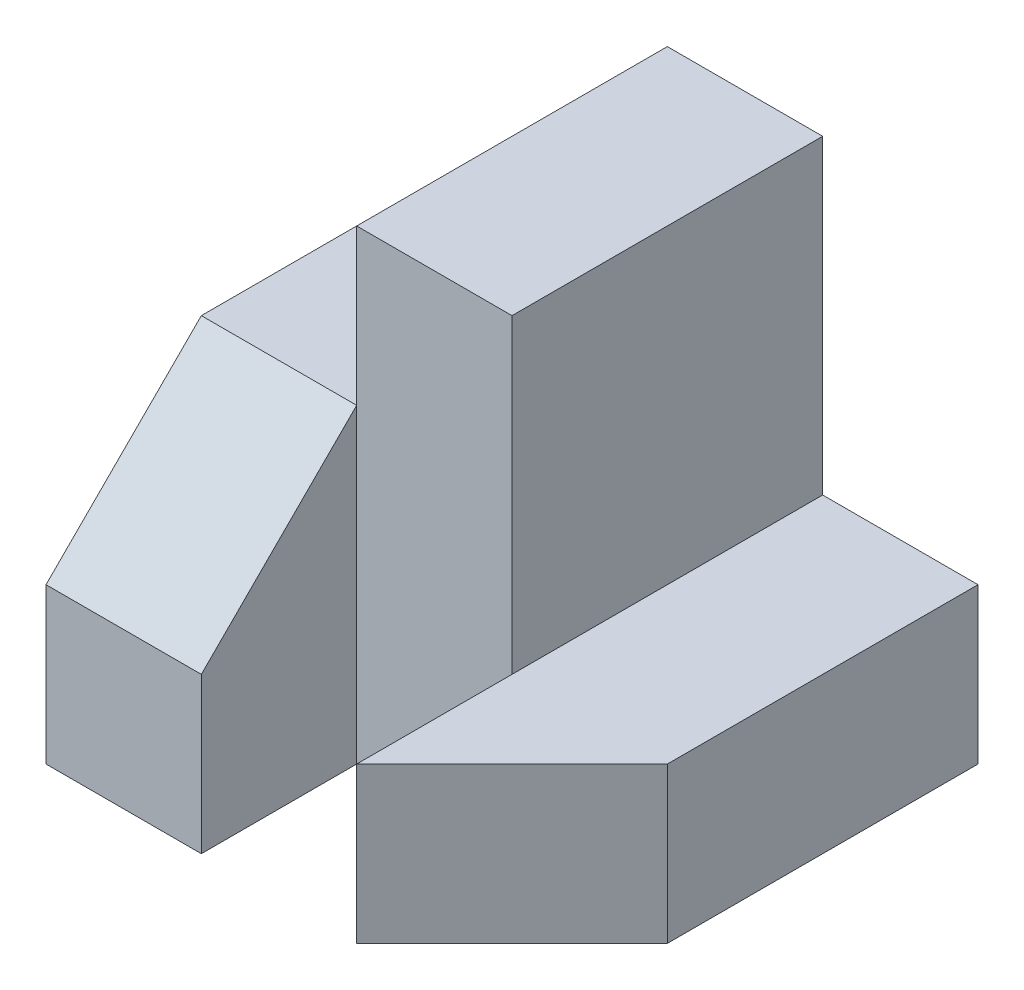
ISO-10303-21;
HEADER;
FILE_DESCRIPTION(('STEP AP214'),'2;1');
FILE_NAME('part.step','',(''),(''),'','','');
FILE_SCHEMA(('AUTOMOTIVE_DESIGN { 1 0 10303 214 1 1 1 1 }'));
ENDSEC;
DATA;
#1=APPLICATION_CONTEXT('core data for automotive mechanical design processes');
#2=APPLICATION_PROTOCOL_DEFINITION('international standard','automotive_design',2000,#1);
#3=PRODUCT_CONTEXT('',#1,'mechanical');
#4=PRODUCT('Part','Part','',(#3));
#5=PRODUCT_RELATED_PRODUCT_CATEGORY('part','',(#4));
#6=PRODUCT_DEFINITION_FORMATION('','',#4);
#7=PRODUCT_DEFINITION_CONTEXT('part definition',#1,'design');
#8=PRODUCT_DEFINITION('design','',#6,#7);
#9=PRODUCT_DEFINITION_SHAPE('','',#8);
#10=(LENGTH_UNIT() NAMED_UNIT(*) SI_UNIT(.MILLI.,.METRE.));
#11=(NAMED_UNIT(*) PLANE_ANGLE_UNIT() SI_UNIT($,.RADIAN.));
#12=(NAMED_UNIT(*) SI_UNIT($,.STERADIAN.) SOLID_ANGLE_UNIT());
#13=UNCERTAINTY_MEASURE_WITH_UNIT(LENGTH_MEASURE(1.E-05),#10,'distance_accuracy_value','');
#14=(GEOMETRIC_REPRESENTATION_CONTEXT(3) GLOBAL_UNCERTAINTY_ASSIGNED_CONTEXT((#13)) GLOBAL_UNIT_ASSIGNED_CONTEXT((#10,
#11,#12)) REPRESENTATION_CONTEXT('',''));
#15=CARTESIAN_POINT('',(0.,0.,0.));
#16=DIRECTION('',(0.,0.,1.));
#17=DIRECTION('',(1.,0.,0.));
#18=AXIS2_PLACEMENT_3D('',#15,#16,#17);
#19=CARTESIAN_POINT('',(20.,30.,-30.));
#20=DIRECTION('',(-1.,0.,0.));
#21=DIRECTION('',(0.,-1.,0.));
#22=AXIS2_PLACEMENT_3D('',#19,#20,#21);
#23=PLANE('',#22);
#24=DIRECTION('',(0.,-1.,0.));
#25=VECTOR('',#24,1.);
#26=CARTESIAN_POINT('',(20.,0.,-10.));
#27=LINE('',#26,#25);
#28=CARTESIAN_POINT('',(20.,30.,-10.));
#29=VERTEX_POINT('',#28);
#30=CARTESIAN_POINT('',(20.,10.,-10.));
#31=VERTEX_POINT('',#30);
#32=EDGE_CURVE('E191',#29,#31,#27,.T.);
#33=ORIENTED_EDGE('',*,*,#32,.T.);
#34=DIRECTION('',(0.,0.,1.));
#35=VECTOR('',#34,1.);
#36=CARTESIAN_POINT('',(20.,10.,-30.));
#37=LINE('',#36,#35);
#38=CARTESIAN_POINT('',(20.,10.,-30.));
#39=VERTEX_POINT('',#38);
#40=EDGE_CURVE('E168',#39,#31,#37,.T.);
#41=ORIENTED_EDGE('',*,*,#40,.F.);
#42=DIRECTION('',(0.,-1.,0.));
#43=VECTOR('',#42,1.);
#44=CARTESIAN_POINT('',(20.,30.,-30.));
#45=LINE('',#44,#43);
#46=CARTESIAN_POINT('',(20.,30.,-30.));
#47=VERTEX_POINT('',#46);
#48=EDGE_CURVE('E175',#47,#39,#45,.T.);
#49=ORIENTED_EDGE('',*,*,#48,.F.);
#50=DIRECTION('',(0.,0.,1.));
#51=VECTOR('',#50,1.);
#52=CARTESIAN_POINT('',(20.,30.,-30.));
#53=LINE('',#52,#51);
#54=EDGE_CURVE('E165',#47,#29,#53,.T.);
#55=ORIENTED_EDGE('',*,*,#54,.T.);
#56=EDGE_LOOP('',(#33,#41,#49,#55));
#57=FACE_BOUND('',#56,.T.);
#58=ADVANCED_FACE('F33',(#57),#23,.F.);
#59=CARTESIAN_POINT('',(0.,0.,-30.));
#60=DIRECTION('',(0.,-1.,0.));
#61=DIRECTION('',(0.,0.,-1.));
#62=AXIS2_PLACEMENT_3D('',#59,#60,#61);
#63=PLANE('',#62);
#64=DIRECTION('',(-0.707106781186551,0.,0.707106781186544));
#65=VECTOR('',#64,1.);
#66=CARTESIAN_POINT('',(9.9999999999999,0.,10.));
#67=LINE('',#66,#65);
#68=CARTESIAN_POINT('',(30.,0.,-9.9999999999999));
#69=VERTEX_POINT('',#68);
#70=CARTESIAN_POINT('',(20.,0.,0.));
#71=VERTEX_POINT('',#70);
#72=EDGE_CURVE('E113',#69,#71,#67,.T.);
#73=ORIENTED_EDGE('',*,*,#72,.T.);
#74=DIRECTION('',(0.,0.,1.));
#75=VECTOR('',#74,1.);
#76=CARTESIAN_POINT('',(20.,0.,0.));
#77=LINE('',#76,#75);
#78=CARTESIAN_POINT('',(20.,0.,-10.));
#79=VERTEX_POINT('',#78);
#80=EDGE_CURVE('E211',#79,#71,#77,.T.);
#81=ORIENTED_EDGE('',*,*,#80,.F.);
#82=DIRECTION('',(1.,0.,0.));
#83=VECTOR('',#82,1.);
#84=CARTESIAN_POINT('',(0.,0.,-10.));
#85=LINE('',#84,#83);
#86=CARTESIAN_POINT('',(10.,0.,-10.));
#87=VERTEX_POINT('',#86);
#88=EDGE_CURVE('E209',#87,#79,#85,.T.);
#89=ORIENTED_EDGE('',*,*,#88,.F.);
#90=DIRECTION('',(0.,0.,1.));
#91=VECTOR('',#90,1.);
#92=CARTESIAN_POINT('',(10.,0.,0.));
#93=LINE('',#92,#91);
#94=CARTESIAN_POINT('',(10.,0.,0.));
#95=VERTEX_POINT('',#94);
#96=EDGE_CURVE('E201',#87,#95,#93,.T.);
#97=ORIENTED_EDGE('',*,*,#96,.T.);
#98=DIRECTION('',(1.,0.,0.));
#99=VECTOR('',#98,1.);
#100=CARTESIAN_POINT('',(0.,0.,0.));
#101=LINE('',#100,#99);
#102=CARTESIAN_POINT('',(0.,0.,0.));
#103=VERTEX_POINT('',#102);
#104=EDGE_CURVE('E138',#103,#95,#101,.T.);
#105=ORIENTED_EDGE('',*,*,#104,.F.);
#106=DIRECTION('',(0.,0.,1.));
#107=VECTOR('',#106,1.);
#108=CARTESIAN_POINT('',(0.,0.,-30.));
#109=LINE('',#108,#107);
#110=CARTESIAN_POINT('',(0.,0.,-30.));
#111=VERTEX_POINT('',#110);
#112=EDGE_CURVE('E133',#111,#103,#109,.T.);
#113=ORIENTED_EDGE('',*,*,#112,.F.);
#114=DIRECTION('',(1.,0.,0.));
#115=VECTOR('',#114,1.);
#116=CARTESIAN_POINT('',(0.,0.,-30.));
#117=LINE('',#116,#115);
#118=CARTESIAN_POINT('',(30.,0.,-30.));
#119=VERTEX_POINT('',#118);
#120=EDGE_CURVE('E132',#111,#119,#117,.T.);
#121=ORIENTED_EDGE('',*,*,#120,.T.);
#122=DIRECTION('',(0.,0.,1.));
#123=VECTOR('',#122,1.);
#124=CARTESIAN_POINT('',(30.,0.,-30.));
#125=LINE('',#124,#123);
#126=EDGE_CURVE('E42',#119,#69,#125,.T.);
#127=ORIENTED_EDGE('',*,*,#126,.T.);
#128=EDGE_LOOP('',(#73,#81,#89,#97,#105,#113,#121,#127));
#129=FACE_BOUND('',#128,.T.);
#130=ADVANCED_FACE('F129',(#129),#63,.T.);
#131=CARTESIAN_POINT('',(0.,0.,-30.));
#132=DIRECTION('',(-1.,0.,0.));
#133=DIRECTION('',(0.,0.,1.));
#134=AXIS2_PLACEMENT_3D('',#131,#132,#133);
#135=PLANE('',#134);
#136=DIRECTION('',(0.,-1.,0.));
#137=VECTOR('',#136,1.);
#138=CARTESIAN_POINT('',(0.,0.,0.));
#139=LINE('',#138,#137);
#140=CARTESIAN_POINT('',(0.,10.,0.));
#141=VERTEX_POINT('',#140);
#142=EDGE_CURVE('E142',#141,#103,#139,.T.);
#143=ORIENTED_EDGE('',*,*,#142,.F.);
#144=DIRECTION('',(0.,-0.707106781186548,0.707106781186548));
#145=VECTOR('',#144,1.);
#146=CARTESIAN_POINT('',(0.,5.,5.));
#147=LINE('',#146,#145);
#148=CARTESIAN_POINT('',(0.,20.,-10.));
#149=VERTEX_POINT('',#148);
#150=EDGE_CURVE('E186',#149,#141,#147,.T.);
#151=ORIENTED_EDGE('',*,*,#150,.F.);
#152=DIRECTION('',(0.,0.,1.));
#153=VECTOR('',#152,1.);
#154=CARTESIAN_POINT('',(0.,20.,-30.));
#155=LINE('',#154,#153);
#156=CARTESIAN_POINT('',(0.,20.,-30.));
#157=VERTEX_POINT('',#156);
#158=EDGE_CURVE('E151',#157,#149,#155,.T.);
#159=ORIENTED_EDGE('',*,*,#158,.F.);
#160=DIRECTION('',(0.,-1.,0.));
#161=VECTOR('',#160,1.);
#162=CARTESIAN_POINT('',(0.,0.,-30.));
#163=LINE('',#162,#161);
#164=EDGE_CURVE('E141',#157,#111,#163,.T.);
#165=ORIENTED_EDGE('',*,*,#164,.T.);
#166=ORIENTED_EDGE('',*,*,#112,.T.);
#167=EDGE_LOOP('',(#143,#151,#159,#165,#166));
#168=FACE_BOUND('',#167,.T.);
#169=ADVANCED_FACE('F35',(#168),#135,.T.);
#170=CARTESIAN_POINT('',(0.,30.,-30.));
#171=DIRECTION('',(0.,1.,0.));
#172=DIRECTION('',(0.,0.,1.));
#173=AXIS2_PLACEMENT_3D('',#170,#171,#172);
#174=PLANE('',#173);
#175=DIRECTION('',(0.,0.,1.));
#176=VECTOR('',#175,1.);
#177=CARTESIAN_POINT('',(10.,30.,-30.));
#178=LINE('',#177,#176);
#179=CARTESIAN_POINT('',(10.,30.,-30.));
#180=VERTEX_POINT('',#179);
#181=CARTESIAN_POINT('',(10.,30.,-10.));
#182=VERTEX_POINT('',#181);
#183=EDGE_CURVE('E145',#180,#182,#178,.T.);
#184=ORIENTED_EDGE('',*,*,#183,.T.);
#185=DIRECTION('',(1.,0.,0.));
#186=VECTOR('',#185,1.);
#187=CARTESIAN_POINT('',(0.,30.,-10.));
#188=LINE('',#187,#186);
#189=EDGE_CURVE('E182',#182,#29,#188,.T.);
#190=ORIENTED_EDGE('',*,*,#189,.T.);
#191=ORIENTED_EDGE('',*,*,#54,.F.);
#192=DIRECTION('',(-1.,0.,0.));
#193=VECTOR('',#192,1.);
#194=CARTESIAN_POINT('',(0.,30.,-30.));
#195=LINE('',#194,#193);
#196=EDGE_CURVE('E136',#47,#180,#195,.T.);
#197=ORIENTED_EDGE('',*,*,#196,.T.);
#198=EDGE_LOOP('',(#184,#190,#191,#197));
#199=FACE_BOUND('',#198,.T.);
#200=ADVANCED_FACE('F248',(#199),#174,.T.);
#201=CARTESIAN_POINT('',(0.,0.,0.));
#202=DIRECTION('',(0.,0.,-1.));
#203=DIRECTION('',(-1.,0.,0.));
#204=AXIS2_PLACEMENT_3D('',#201,#202,#203);
#205=PLANE('',#204);
#206=ORIENTED_EDGE('',*,*,#104,.T.);
#207=DIRECTION('',(0.,1.,0.));
#208=VECTOR('',#207,1.);
#209=CARTESIAN_POINT('',(10.,0.,0.));
#210=LINE('',#209,#208);
#211=CARTESIAN_POINT('',(10.,10.,0.));
#212=VERTEX_POINT('',#211);
#213=EDGE_CURVE('E203',#95,#212,#210,.T.);
#214=ORIENTED_EDGE('',*,*,#213,.T.);
#215=DIRECTION('',(1.,0.,0.));
#216=VECTOR('',#215,1.);
#217=CARTESIAN_POINT('',(0.,10.,0.));
#218=LINE('',#217,#216);
#219=EDGE_CURVE('E185',#141,#212,#218,.T.);
#220=ORIENTED_EDGE('',*,*,#219,.F.);
#221=ORIENTED_EDGE('',*,*,#142,.T.);
#222=EDGE_LOOP('',(#206,#214,#220,#221));
#223=FACE_BOUND('',#222,.T.);
#224=ADVANCED_FACE('F231',(#223),#205,.F.);
#225=CARTESIAN_POINT('',(10.,30.,-30.));
#226=DIRECTION('',(1.,0.,0.));
#227=DIRECTION('',(0.,0.,-1.));
#228=AXIS2_PLACEMENT_3D('',#225,#226,#227);
#229=PLANE('',#228);
#230=DIRECTION('',(0.,-1.,0.));
#231=VECTOR('',#230,1.);
#232=CARTESIAN_POINT('',(10.,30.,-9.99999999999999));
#233=LINE('',#232,#231);
#234=CARTESIAN_POINT('',(10.,20.,-10.));
#235=VERTEX_POINT('',#234);
#236=EDGE_CURVE('E178',#182,#235,#233,.T.);
#237=ORIENTED_EDGE('',*,*,#236,.F.);
#238=ORIENTED_EDGE('',*,*,#183,.F.);
#239=DIRECTION('',(0.,1.,0.));
#240=VECTOR('',#239,1.);
#241=CARTESIAN_POINT('',(10.,30.,-30.));
#242=LINE('',#241,#240);
#243=CARTESIAN_POINT('',(10.,20.,-30.));
#244=VERTEX_POINT('',#243);
#245=EDGE_CURVE('E155',#244,#180,#242,.T.);
#246=ORIENTED_EDGE('',*,*,#245,.F.);
#247=DIRECTION('',(0.,0.,1.));
#248=VECTOR('',#247,1.);
#249=CARTESIAN_POINT('',(10.,20.,-30.));
#250=LINE('',#249,#248);
#251=EDGE_CURVE('E154',#244,#235,#250,.T.);
#252=ORIENTED_EDGE('',*,*,#251,.T.);
#253=EDGE_LOOP('',(#237,#238,#246,#252));
#254=FACE_BOUND('',#253,.T.);
#255=ADVANCED_FACE('F251',(#254),#229,.F.);
#256=CARTESIAN_POINT('',(0.,20.,-30.));
#257=DIRECTION('',(0.,-1.,0.));
#258=DIRECTION('',(0.,0.,-1.));
#259=AXIS2_PLACEMENT_3D('',#256,#257,#258);
#260=PLANE('',#259);
#261=DIRECTION('',(1.,0.,0.));
#262=VECTOR('',#261,1.);
#263=CARTESIAN_POINT('',(0.,20.,-10.));
#264=LINE('',#263,#262);
#265=EDGE_CURVE('E181',#149,#235,#264,.T.);
#266=ORIENTED_EDGE('',*,*,#265,.T.);
#267=ORIENTED_EDGE('',*,*,#251,.F.);
#268=DIRECTION('',(1.,0.,0.));
#269=VECTOR('',#268,1.);
#270=CARTESIAN_POINT('',(0.,20.,-30.));
#271=LINE('',#270,#269);
#272=EDGE_CURVE('E162',#157,#244,#271,.T.);
#273=ORIENTED_EDGE('',*,*,#272,.F.);
#274=ORIENTED_EDGE('',*,*,#158,.T.);
#275=EDGE_LOOP('',(#266,#267,#273,#274));
#276=FACE_BOUND('',#275,.T.);
#277=ADVANCED_FACE('F240',(#276),#260,.F.);
#278=CARTESIAN_POINT('',(30.,0.,-30.));
#279=DIRECTION('',(1.,0.,0.));
#280=DIRECTION('',(0.,0.,-1.));
#281=AXIS2_PLACEMENT_3D('',#278,#279,#280);
#282=PLANE('',#281);
#283=DIRECTION('',(0.,1.,0.));
#284=VECTOR('',#283,1.);
#285=CARTESIAN_POINT('',(30.,0.,-9.9999999999999));
#286=LINE('',#285,#284);
#287=CARTESIAN_POINT('',(30.,10.,-9.9999999999999));
#288=VERTEX_POINT('',#287);
#289=EDGE_CURVE('E115',#69,#288,#286,.T.);
#290=ORIENTED_EDGE('',*,*,#289,.F.);
#291=ORIENTED_EDGE('',*,*,#126,.F.);
#292=DIRECTION('',(0.,1.,0.));
#293=VECTOR('',#292,1.);
#294=CARTESIAN_POINT('',(30.,0.,-30.));
#295=LINE('',#294,#293);
#296=CARTESIAN_POINT('',(30.,10.,-30.));
#297=VERTEX_POINT('',#296);
#298=EDGE_CURVE('E147',#119,#297,#295,.T.);
#299=ORIENTED_EDGE('',*,*,#298,.T.);
#300=DIRECTION('',(0.,0.,1.));
#301=VECTOR('',#300,1.);
#302=CARTESIAN_POINT('',(30.,10.,-30.));
#303=LINE('',#302,#301);
#304=EDGE_CURVE('E125',#297,#288,#303,.T.);
#305=ORIENTED_EDGE('',*,*,#304,.T.);
#306=EDGE_LOOP('',(#290,#291,#299,#305));
#307=FACE_BOUND('',#306,.T.);
#308=ADVANCED_FACE('F124',(#307),#282,.T.);
#309=CARTESIAN_POINT('',(0.,0.,-30.));
#310=DIRECTION('',(0.,0.,-1.));
#311=DIRECTION('',(-1.,0.,0.));
#312=AXIS2_PLACEMENT_3D('',#309,#310,#311);
#313=PLANE('',#312);
#314=DIRECTION('',(1.,0.,0.));
#315=VECTOR('',#314,1.);
#316=CARTESIAN_POINT('',(30.,10.,-30.));
#317=LINE('',#316,#315);
#318=EDGE_CURVE('E169',#39,#297,#317,.T.);
#319=ORIENTED_EDGE('',*,*,#318,.T.);
#320=ORIENTED_EDGE('',*,*,#298,.F.);
#321=ORIENTED_EDGE('',*,*,#120,.F.);
#322=ORIENTED_EDGE('',*,*,#164,.F.);
#323=ORIENTED_EDGE('',*,*,#272,.T.);
#324=ORIENTED_EDGE('',*,*,#245,.T.);
#325=ORIENTED_EDGE('',*,*,#196,.F.);
#326=ORIENTED_EDGE('',*,*,#48,.T.);
#327=EDGE_LOOP('',(#319,#320,#321,#322,#323,#324,#325,#326));
#328=FACE_BOUND('',#327,.T.);
#329=ADVANCED_FACE('F243',(#328),#313,.T.);
#330=CARTESIAN_POINT('',(30.,10.,-30.));
#331=DIRECTION('',(0.,-1.,0.));
#332=DIRECTION('',(0.,0.,-1.));
#333=AXIS2_PLACEMENT_3D('',#330,#331,#332);
#334=PLANE('',#333);
#335=DIRECTION('',(0.,0.,-1.));
#336=VECTOR('',#335,1.);
#337=CARTESIAN_POINT('',(20.,10.,-30.));
#338=LINE('',#337,#336);
#339=CARTESIAN_POINT('',(20.,9.99999999999999,0.));
#340=VERTEX_POINT('',#339);
#341=EDGE_CURVE('E193',#340,#31,#338,.T.);
#342=ORIENTED_EDGE('',*,*,#341,.F.);
#343=DIRECTION('',(0.707106781186551,0.,-0.707106781186544));
#344=VECTOR('',#343,1.);
#345=CARTESIAN_POINT('',(40.0000000000001,10.,-19.9999999999998));
#346=LINE('',#345,#344);
#347=EDGE_CURVE('E126',#340,#288,#346,.T.);
#348=ORIENTED_EDGE('',*,*,#347,.T.);
#349=ORIENTED_EDGE('',*,*,#304,.F.);
#350=ORIENTED_EDGE('',*,*,#318,.F.);
#351=ORIENTED_EDGE('',*,*,#40,.T.);
#352=EDGE_LOOP('',(#342,#348,#349,#350,#351));
#353=FACE_BOUND('',#352,.T.);
#354=ADVANCED_FACE('F215',(#353),#334,.F.);
#355=CARTESIAN_POINT('',(0.,0.,-10.));
#356=DIRECTION('',(0.,0.,1.));
#357=DIRECTION('',(0.,-1.,0.));
#358=AXIS2_PLACEMENT_3D('',#355,#356,#357);
#359=PLANE('',#358);
#360=ORIENTED_EDGE('',*,*,#236,.T.);
#361=DIRECTION('',(0.,1.,0.));
#362=VECTOR('',#361,1.);
#363=CARTESIAN_POINT('',(10.,0.,-10.));
#364=LINE('',#363,#362);
#365=EDGE_CURVE('E200',#87,#235,#364,.T.);
#366=ORIENTED_EDGE('',*,*,#365,.F.);
#367=ORIENTED_EDGE('',*,*,#88,.T.);
#368=DIRECTION('',(0.,1.,0.));
#369=VECTOR('',#368,1.);
#370=CARTESIAN_POINT('',(20.,0.,-10.));
#371=LINE('',#370,#369);
#372=EDGE_CURVE('E197',#79,#31,#371,.T.);
#373=ORIENTED_EDGE('',*,*,#372,.T.);
#374=ORIENTED_EDGE('',*,*,#32,.F.);
#375=ORIENTED_EDGE('',*,*,#189,.F.);
#376=EDGE_LOOP('',(#360,#366,#367,#373,#374,#375));
#377=FACE_BOUND('',#376,.T.);
#378=ADVANCED_FACE('F224',(#377),#359,.T.);
#379=CARTESIAN_POINT('',(0.,5.,5.));
#380=DIRECTION('',(0.,0.707106781186547,0.707106781186547));
#381=DIRECTION('',(0.,-0.707106781186548,0.707106781186548));
#382=AXIS2_PLACEMENT_3D('',#379,#380,#381);
#383=PLANE('',#382);
#384=DIRECTION('',(0.,-0.707106781186547,0.707106781186547));
#385=VECTOR('',#384,1.);
#386=CARTESIAN_POINT('',(10.,5.,5.));
#387=LINE('',#386,#385);
#388=EDGE_CURVE('E11',#235,#212,#387,.T.);
#389=ORIENTED_EDGE('',*,*,#388,.F.);
#390=ORIENTED_EDGE('',*,*,#265,.F.);
#391=ORIENTED_EDGE('',*,*,#150,.T.);
#392=ORIENTED_EDGE('',*,*,#219,.T.);
#393=EDGE_LOOP('',(#389,#390,#391,#392));
#394=FACE_BOUND('',#393,.T.);
#395=ADVANCED_FACE('F234',(#394),#383,.T.);
#396=CARTESIAN_POINT('',(20.,0.,0.));
#397=DIRECTION('',(-1.,0.,0.));
#398=DIRECTION('',(0.,0.,1.));
#399=AXIS2_PLACEMENT_3D('',#396,#397,#398);
#400=PLANE('',#399);
#401=ORIENTED_EDGE('',*,*,#341,.T.);
#402=ORIENTED_EDGE('',*,*,#372,.F.);
#403=ORIENTED_EDGE('',*,*,#80,.T.);
#404=DIRECTION('',(0.,1.,0.));
#405=VECTOR('',#404,1.);
#406=CARTESIAN_POINT('',(20.,0.,0.));
#407=LINE('',#406,#405);
#408=EDGE_CURVE('E118',#71,#340,#407,.T.);
#409=ORIENTED_EDGE('',*,*,#408,.T.);
#410=EDGE_LOOP('',(#401,#402,#403,#409));
#411=FACE_BOUND('',#410,.T.);
#412=ADVANCED_FACE('F218',(#411),#400,.T.);
#413=CARTESIAN_POINT('',(10.,0.,0.));
#414=DIRECTION('',(-1.,0.,0.));
#415=DIRECTION('',(0.,0.,1.));
#416=AXIS2_PLACEMENT_3D('',#413,#414,#415);
#417=PLANE('',#416);
#418=ORIENTED_EDGE('',*,*,#388,.T.);
#419=ORIENTED_EDGE('',*,*,#213,.F.);
#420=ORIENTED_EDGE('',*,*,#96,.F.);
#421=ORIENTED_EDGE('',*,*,#365,.T.);
#422=EDGE_LOOP('',(#418,#419,#420,#421));
#423=FACE_BOUND('',#422,.T.);
#424=ADVANCED_FACE('F228',(#423),#417,.F.);
#425=CARTESIAN_POINT('',(9.9999999999999,0.,10.));
#426=DIRECTION('',(-0.707106781186544,0.,-0.707106781186551));
#427=DIRECTION('',(-0.707106781186551,0.,0.707106781186544));
#428=AXIS2_PLACEMENT_3D('',#425,#426,#427);
#429=PLANE('',#428);
#430=ORIENTED_EDGE('',*,*,#408,.F.);
#431=ORIENTED_EDGE('',*,*,#72,.F.);
#432=ORIENTED_EDGE('',*,*,#289,.T.);
#433=ORIENTED_EDGE('',*,*,#347,.F.);
#434=EDGE_LOOP('',(#430,#431,#432,#433));
#435=FACE_BOUND('',#434,.T.);
#436=ADVANCED_FACE('F114',(#435),#429,.F.);
#437=CLOSED_SHELL('',(#58,#130,#169,#200,#224,#255,#277,#308,#329,#354,#378,#395,#412,#424,#436));
#438=MANIFOLD_SOLID_BREP('B2',#437);
#439=ADVANCED_BREP_SHAPE_REPRESENTATION('',(#18,#438),#14);
#440=SHAPE_DEFINITION_REPRESENTATION(#9,#439);
ENDSEC;
END-ISO-10303-21;
